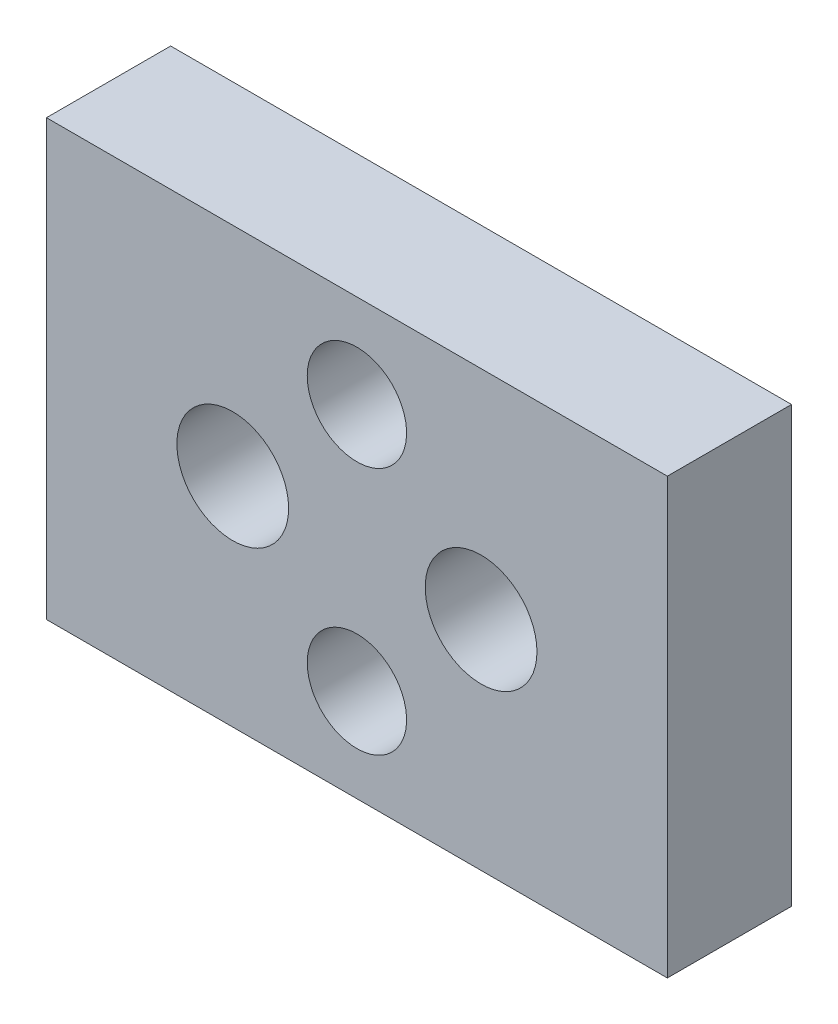
ISO-10303-21;
HEADER;
FILE_DESCRIPTION(('STEP AP214'),'2;1');
FILE_NAME('part.step','',(''),(''),'','','');
FILE_SCHEMA(('AUTOMOTIVE_DESIGN { 1 0 10303 214 1 1 1 1 }'));
ENDSEC;
DATA;
#1=APPLICATION_CONTEXT('core data for automotive mechanical design processes');
#2=APPLICATION_PROTOCOL_DEFINITION('international standard','automotive_design',2000,#1);
#3=PRODUCT_CONTEXT('',#1,'mechanical');
#4=PRODUCT('Part','Part','',(#3));
#5=PRODUCT_RELATED_PRODUCT_CATEGORY('part','',(#4));
#6=PRODUCT_DEFINITION_FORMATION('','',#4);
#7=PRODUCT_DEFINITION_CONTEXT('part definition',#1,'design');
#8=PRODUCT_DEFINITION('design','',#6,#7);
#9=PRODUCT_DEFINITION_SHAPE('','',#8);
#10=(LENGTH_UNIT() NAMED_UNIT(*) SI_UNIT(.MILLI.,.METRE.));
#11=(NAMED_UNIT(*) PLANE_ANGLE_UNIT() SI_UNIT($,.RADIAN.));
#12=(NAMED_UNIT(*) SI_UNIT($,.STERADIAN.) SOLID_ANGLE_UNIT());
#13=UNCERTAINTY_MEASURE_WITH_UNIT(LENGTH_MEASURE(1.E-05),#10,'distance_accuracy_value','');
#14=(GEOMETRIC_REPRESENTATION_CONTEXT(3) GLOBAL_UNCERTAINTY_ASSIGNED_CONTEXT((#13)) GLOBAL_UNIT_ASSIGNED_CONTEXT((#10,
#11,#12)) REPRESENTATION_CONTEXT('',''));
#15=CARTESIAN_POINT('',(0.,0.,0.));
#16=DIRECTION('',(0.,0.,1.));
#17=DIRECTION('',(1.,0.,0.));
#18=AXIS2_PLACEMENT_3D('',#15,#16,#17);
#19=CARTESIAN_POINT('',(0.,0.,5.));
#20=DIRECTION('',(1.,0.,0.));
#21=DIRECTION('',(0.,0.,-1.));
#22=AXIS2_PLACEMENT_3D('',#19,#20,#21);
#23=PLANE('',#22);
#24=DIRECTION('',(0.,-1.,0.));
#25=VECTOR('',#24,1.);
#26=CARTESIAN_POINT('',(0.,0.,0.));
#27=LINE('',#26,#25);
#28=CARTESIAN_POINT('',(0.,17.5,0.));
#29=VERTEX_POINT('',#28);
#30=CARTESIAN_POINT('',(0.,0.,0.));
#31=VERTEX_POINT('',#30);
#32=EDGE_CURVE('E80',#29,#31,#27,.T.);
#33=ORIENTED_EDGE('',*,*,#32,.T.);
#34=DIRECTION('',(0.,0.,-1.));
#35=VECTOR('',#34,1.);
#36=CARTESIAN_POINT('',(0.,0.,5.));
#37=LINE('',#36,#35);
#38=CARTESIAN_POINT('',(0.,0.,5.));
#39=VERTEX_POINT('',#38);
#40=EDGE_CURVE('E11',#39,#31,#37,.T.);
#41=ORIENTED_EDGE('',*,*,#40,.F.);
#42=DIRECTION('',(0.,-1.,0.));
#43=VECTOR('',#42,1.);
#44=CARTESIAN_POINT('',(0.,0.,5.));
#45=LINE('',#44,#43);
#46=CARTESIAN_POINT('',(0.,17.5,5.));
#47=VERTEX_POINT('',#46);
#48=EDGE_CURVE('E68',#47,#39,#45,.T.);
#49=ORIENTED_EDGE('',*,*,#48,.F.);
#50=DIRECTION('',(0.,0.,-1.));
#51=VECTOR('',#50,1.);
#52=CARTESIAN_POINT('',(0.,17.5,5.));
#53=LINE('',#52,#51);
#54=EDGE_CURVE('E76',#47,#29,#53,.T.);
#55=ORIENTED_EDGE('',*,*,#54,.T.);
#56=EDGE_LOOP('',(#33,#41,#49,#55));
#57=FACE_BOUND('',#56,.T.);
#58=ADVANCED_FACE('F17',(#57),#23,.F.);
#59=CARTESIAN_POINT('',(0.,0.,5.));
#60=DIRECTION('',(0.,1.,0.));
#61=DIRECTION('',(0.,0.,1.));
#62=AXIS2_PLACEMENT_3D('',#59,#60,#61);
#63=PLANE('',#62);
#64=DIRECTION('',(1.,0.,0.));
#65=VECTOR('',#64,1.);
#66=CARTESIAN_POINT('',(0.,0.,0.));
#67=LINE('',#66,#65);
#68=CARTESIAN_POINT('',(25.,0.,0.));
#69=VERTEX_POINT('',#68);
#70=EDGE_CURVE('E72',#31,#69,#67,.T.);
#71=ORIENTED_EDGE('',*,*,#70,.T.);
#72=DIRECTION('',(0.,0.,-1.));
#73=VECTOR('',#72,1.);
#74=CARTESIAN_POINT('',(25.,0.,5.));
#75=LINE('',#74,#73);
#76=CARTESIAN_POINT('',(25.,0.,5.));
#77=VERTEX_POINT('',#76);
#78=EDGE_CURVE('E25',#77,#69,#75,.T.);
#79=ORIENTED_EDGE('',*,*,#78,.F.);
#80=DIRECTION('',(1.,0.,0.));
#81=VECTOR('',#80,1.);
#82=CARTESIAN_POINT('',(0.,0.,5.));
#83=LINE('',#82,#81);
#84=EDGE_CURVE('E63',#39,#77,#83,.T.);
#85=ORIENTED_EDGE('',*,*,#84,.F.);
#86=ORIENTED_EDGE('',*,*,#40,.T.);
#87=EDGE_LOOP('',(#71,#79,#85,#86));
#88=FACE_BOUND('',#87,.T.);
#89=ADVANCED_FACE('F71',(#88),#63,.F.);
#90=CARTESIAN_POINT('',(25.,0.,5.));
#91=DIRECTION('',(-1.,0.,0.));
#92=DIRECTION('',(0.,0.,1.));
#93=AXIS2_PLACEMENT_3D('',#90,#91,#92);
#94=PLANE('',#93);
#95=DIRECTION('',(0.,1.,0.));
#96=VECTOR('',#95,1.);
#97=CARTESIAN_POINT('',(25.,0.,0.));
#98=LINE('',#97,#96);
#99=CARTESIAN_POINT('',(25.,17.5,0.));
#100=VERTEX_POINT('',#99);
#101=EDGE_CURVE('E50',#69,#100,#98,.T.);
#102=ORIENTED_EDGE('',*,*,#101,.T.);
#103=DIRECTION('',(0.,0.,-1.));
#104=VECTOR('',#103,1.);
#105=CARTESIAN_POINT('',(25.,17.5,5.));
#106=LINE('',#105,#104);
#107=CARTESIAN_POINT('',(25.,17.5,5.));
#108=VERTEX_POINT('',#107);
#109=EDGE_CURVE('E73',#108,#100,#106,.T.);
#110=ORIENTED_EDGE('',*,*,#109,.F.);
#111=DIRECTION('',(0.,1.,0.));
#112=VECTOR('',#111,1.);
#113=CARTESIAN_POINT('',(25.,0.,5.));
#114=LINE('',#113,#112);
#115=EDGE_CURVE('E66',#77,#108,#114,.T.);
#116=ORIENTED_EDGE('',*,*,#115,.F.);
#117=ORIENTED_EDGE('',*,*,#78,.T.);
#118=EDGE_LOOP('',(#102,#110,#116,#117));
#119=FACE_BOUND('',#118,.T.);
#120=ADVANCED_FACE('F74',(#119),#94,.F.);
#121=CARTESIAN_POINT('',(0.,17.5,5.));
#122=DIRECTION('',(0.,-1.,0.));
#123=DIRECTION('',(0.,0.,-1.));
#124=AXIS2_PLACEMENT_3D('',#121,#122,#123);
#125=PLANE('',#124);
#126=DIRECTION('',(-1.,0.,0.));
#127=VECTOR('',#126,1.);
#128=CARTESIAN_POINT('',(0.,17.5,0.));
#129=LINE('',#128,#127);
#130=EDGE_CURVE('E56',#100,#29,#129,.T.);
#131=ORIENTED_EDGE('',*,*,#130,.T.);
#132=ORIENTED_EDGE('',*,*,#54,.F.);
#133=DIRECTION('',(-1.,0.,0.));
#134=VECTOR('',#133,1.);
#135=CARTESIAN_POINT('',(0.,17.5,5.));
#136=LINE('',#135,#134);
#137=EDGE_CURVE('E33',#108,#47,#136,.T.);
#138=ORIENTED_EDGE('',*,*,#137,.F.);
#139=ORIENTED_EDGE('',*,*,#109,.T.);
#140=EDGE_LOOP('',(#131,#132,#138,#139));
#141=FACE_BOUND('',#140,.T.);
#142=ADVANCED_FACE('F88',(#141),#125,.F.);
#143=CARTESIAN_POINT('',(0.,0.,5.));
#144=DIRECTION('',(0.,0.,-1.));
#145=DIRECTION('',(-1.,0.,0.));
#146=AXIS2_PLACEMENT_3D('',#143,#144,#145);
#147=PLANE('',#146);
#148=CARTESIAN_POINT('',(12.5,3.75,5.));
#149=DIRECTION('',(0.,0.,-1.));
#150=DIRECTION('',(-1.,0.,0.));
#151=AXIS2_PLACEMENT_3D('',#148,#149,#150);
#152=CIRCLE('',#151,2.);
#153=CARTESIAN_POINT('',(10.5,3.75,5.));
#154=VERTEX_POINT('',#153);
#155=EDGE_CURVE('E111',#154,#154,#152,.T.);
#156=ORIENTED_EDGE('',*,*,#155,.T.);
#157=EDGE_LOOP('',(#156));
#158=FACE_BOUND('',#157,.T.);
#159=CARTESIAN_POINT('',(12.5,13.75,5.));
#160=DIRECTION('',(0.,0.,-1.));
#161=DIRECTION('',(-1.,0.,0.));
#162=AXIS2_PLACEMENT_3D('',#159,#160,#161);
#163=CIRCLE('',#162,2.);
#164=CARTESIAN_POINT('',(10.5,13.75,5.));
#165=VERTEX_POINT('',#164);
#166=EDGE_CURVE('E105',#165,#165,#163,.T.);
#167=ORIENTED_EDGE('',*,*,#166,.T.);
#168=EDGE_LOOP('',(#167));
#169=FACE_BOUND('',#168,.T.);
#170=CARTESIAN_POINT('',(7.5,8.75,5.));
#171=DIRECTION('',(0.,0.,1.));
#172=DIRECTION('',(1.,0.,0.));
#173=AXIS2_PLACEMENT_3D('',#170,#171,#172);
#174=CIRCLE('',#173,2.25);
#175=CARTESIAN_POINT('',(9.75,8.75,5.));
#176=VERTEX_POINT('',#175);
#177=EDGE_CURVE('E102',#176,#176,#174,.T.);
#178=ORIENTED_EDGE('',*,*,#177,.F.);
#179=EDGE_LOOP('',(#178));
#180=FACE_BOUND('',#179,.T.);
#181=CARTESIAN_POINT('',(17.5,8.75,5.));
#182=DIRECTION('',(0.,0.,1.));
#183=DIRECTION('',(1.,0.,0.));
#184=AXIS2_PLACEMENT_3D('',#181,#182,#183);
#185=CIRCLE('',#184,2.25);
#186=CARTESIAN_POINT('',(19.75,8.75,5.));
#187=VERTEX_POINT('',#186);
#188=EDGE_CURVE('E96',#187,#187,#185,.T.);
#189=ORIENTED_EDGE('',*,*,#188,.F.);
#190=EDGE_LOOP('',(#189));
#191=FACE_BOUND('',#190,.T.);
#192=ORIENTED_EDGE('',*,*,#48,.T.);
#193=ORIENTED_EDGE('',*,*,#84,.T.);
#194=ORIENTED_EDGE('',*,*,#115,.T.);
#195=ORIENTED_EDGE('',*,*,#137,.T.);
#196=EDGE_LOOP('',(#192,#193,#194,#195));
#197=FACE_BOUND('',#196,.T.);
#198=ADVANCED_FACE('F64',(#158,#169,#180,#191,#197),#147,.F.);
#199=CARTESIAN_POINT('',(0.,0.,0.));
#200=DIRECTION('',(0.,0.,-1.));
#201=DIRECTION('',(-1.,0.,0.));
#202=AXIS2_PLACEMENT_3D('',#199,#200,#201);
#203=PLANE('',#202);
#204=CARTESIAN_POINT('',(12.5,3.75,0.));
#205=DIRECTION('',(0.,0.,-1.));
#206=DIRECTION('',(-1.,0.,0.));
#207=AXIS2_PLACEMENT_3D('',#204,#205,#206);
#208=CIRCLE('',#207,2.);
#209=CARTESIAN_POINT('',(10.5,3.75,0.));
#210=VERTEX_POINT('',#209);
#211=EDGE_CURVE('E114',#210,#210,#208,.T.);
#212=ORIENTED_EDGE('',*,*,#211,.F.);
#213=EDGE_LOOP('',(#212));
#214=FACE_BOUND('',#213,.T.);
#215=CARTESIAN_POINT('',(12.5,13.75,0.));
#216=DIRECTION('',(0.,0.,-1.));
#217=DIRECTION('',(-1.,0.,0.));
#218=AXIS2_PLACEMENT_3D('',#215,#216,#217);
#219=CIRCLE('',#218,2.);
#220=CARTESIAN_POINT('',(10.5,13.75,0.));
#221=VERTEX_POINT('',#220);
#222=EDGE_CURVE('E108',#221,#221,#219,.T.);
#223=ORIENTED_EDGE('',*,*,#222,.F.);
#224=EDGE_LOOP('',(#223));
#225=FACE_BOUND('',#224,.T.);
#226=CARTESIAN_POINT('',(7.5,8.75,0.));
#227=DIRECTION('',(0.,0.,1.));
#228=DIRECTION('',(1.,0.,0.));
#229=AXIS2_PLACEMENT_3D('',#226,#227,#228);
#230=CIRCLE('',#229,2.25);
#231=CARTESIAN_POINT('',(9.75,8.75,0.));
#232=VERTEX_POINT('',#231);
#233=EDGE_CURVE('E99',#232,#232,#230,.T.);
#234=ORIENTED_EDGE('',*,*,#233,.T.);
#235=EDGE_LOOP('',(#234));
#236=FACE_BOUND('',#235,.T.);
#237=CARTESIAN_POINT('',(17.5,8.75,0.));
#238=DIRECTION('',(0.,0.,1.));
#239=DIRECTION('',(1.,0.,0.));
#240=AXIS2_PLACEMENT_3D('',#237,#238,#239);
#241=CIRCLE('',#240,2.25);
#242=CARTESIAN_POINT('',(19.75,8.75,0.));
#243=VERTEX_POINT('',#242);
#244=EDGE_CURVE('E83',#243,#243,#241,.T.);
#245=ORIENTED_EDGE('',*,*,#244,.T.);
#246=EDGE_LOOP('',(#245));
#247=FACE_BOUND('',#246,.T.);
#248=ORIENTED_EDGE('',*,*,#32,.F.);
#249=ORIENTED_EDGE('',*,*,#130,.F.);
#250=ORIENTED_EDGE('',*,*,#101,.F.);
#251=ORIENTED_EDGE('',*,*,#70,.F.);
#252=EDGE_LOOP('',(#248,#249,#250,#251));
#253=FACE_BOUND('',#252,.T.);
#254=ADVANCED_FACE('F91',(#214,#225,#236,#247,#253),#203,.T.);
#255=CARTESIAN_POINT('',(17.5,8.75,5.));
#256=DIRECTION('',(0.,0.,1.));
#257=DIRECTION('',(1.,0.,0.));
#258=AXIS2_PLACEMENT_3D('',#255,#256,#257);
#259=CYLINDRICAL_SURFACE('',#258,2.25);
#260=ORIENTED_EDGE('',*,*,#244,.F.);
#261=EDGE_LOOP('',(#260));
#262=FACE_BOUND('',#261,.T.);
#263=ORIENTED_EDGE('',*,*,#188,.T.);
#264=EDGE_LOOP('',(#263));
#265=FACE_BOUND('',#264,.T.);
#266=ADVANCED_FACE('F122',(#262,#265),#259,.F.);
#267=CARTESIAN_POINT('',(7.5,8.75,5.));
#268=DIRECTION('',(0.,0.,1.));
#269=DIRECTION('',(1.,0.,0.));
#270=AXIS2_PLACEMENT_3D('',#267,#268,#269);
#271=CYLINDRICAL_SURFACE('',#270,2.25);
#272=ORIENTED_EDGE('',*,*,#233,.F.);
#273=EDGE_LOOP('',(#272));
#274=FACE_BOUND('',#273,.T.);
#275=ORIENTED_EDGE('',*,*,#177,.T.);
#276=EDGE_LOOP('',(#275));
#277=FACE_BOUND('',#276,.T.);
#278=ADVANCED_FACE('F132',(#274,#277),#271,.F.);
#279=CARTESIAN_POINT('',(12.5,13.75,0.));
#280=DIRECTION('',(0.,0.,-1.));
#281=DIRECTION('',(-1.,0.,0.));
#282=AXIS2_PLACEMENT_3D('',#279,#280,#281);
#283=CYLINDRICAL_SURFACE('',#282,2.);
#284=ORIENTED_EDGE('',*,*,#166,.F.);
#285=EDGE_LOOP('',(#284));
#286=FACE_BOUND('',#285,.T.);
#287=ORIENTED_EDGE('',*,*,#222,.T.);
#288=EDGE_LOOP('',(#287));
#289=FACE_BOUND('',#288,.T.);
#290=ADVANCED_FACE('F209',(#286,#289),#283,.F.);
#291=CARTESIAN_POINT('',(12.5,3.75,0.));
#292=DIRECTION('',(0.,0.,-1.));
#293=DIRECTION('',(-1.,0.,0.));
#294=AXIS2_PLACEMENT_3D('',#291,#292,#293);
#295=CYLINDRICAL_SURFACE('',#294,2.);
#296=ORIENTED_EDGE('',*,*,#155,.F.);
#297=EDGE_LOOP('',(#296));
#298=FACE_BOUND('',#297,.T.);
#299=ORIENTED_EDGE('',*,*,#211,.T.);
#300=EDGE_LOOP('',(#299));
#301=FACE_BOUND('',#300,.T.);
#302=ADVANCED_FACE('F118',(#298,#301),#295,.F.);
#303=CLOSED_SHELL('',(#58,#89,#120,#142,#198,#254,#266,#278,#290,#302));
#304=MANIFOLD_SOLID_BREP('B1',#303);
#305=ADVANCED_BREP_SHAPE_REPRESENTATION('',(#18,#304),#14);
#306=SHAPE_DEFINITION_REPRESENTATION(#9,#305);
ENDSEC;
END-ISO-10303-21;
